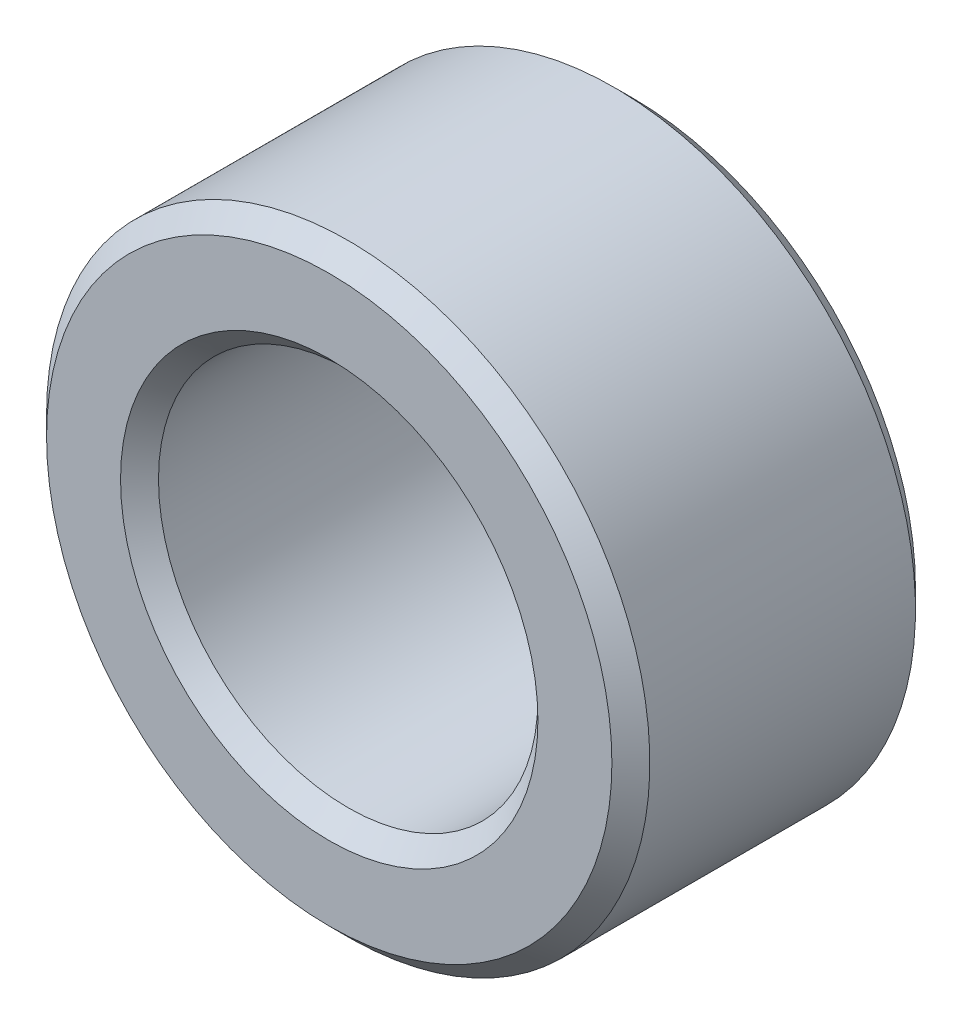
ISO-10303-21;
HEADER;
FILE_DESCRIPTION(('STEP AP214'),'2;1');
FILE_NAME('part.step','',(''),(''),'','','');
FILE_SCHEMA(('AUTOMOTIVE_DESIGN { 1 0 10303 214 1 1 1 1 }'));
ENDSEC;
DATA;
#1=APPLICATION_CONTEXT('core data for automotive mechanical design processes');
#2=APPLICATION_PROTOCOL_DEFINITION('international standard','automotive_design',2000,#1);
#3=PRODUCT_CONTEXT('',#1,'mechanical');
#4=PRODUCT('Part','Part','',(#3));
#5=PRODUCT_RELATED_PRODUCT_CATEGORY('part','',(#4));
#6=PRODUCT_DEFINITION_FORMATION('','',#4);
#7=PRODUCT_DEFINITION_CONTEXT('part definition',#1,'design');
#8=PRODUCT_DEFINITION('design','',#6,#7);
#9=PRODUCT_DEFINITION_SHAPE('','',#8);
#10=(LENGTH_UNIT() NAMED_UNIT(*) SI_UNIT(.MILLI.,.METRE.));
#11=(NAMED_UNIT(*) PLANE_ANGLE_UNIT() SI_UNIT($,.RADIAN.));
#12=(NAMED_UNIT(*) SI_UNIT($,.STERADIAN.) SOLID_ANGLE_UNIT());
#13=UNCERTAINTY_MEASURE_WITH_UNIT(LENGTH_MEASURE(1.E-05),#10,'distance_accuracy_value','');
#14=(GEOMETRIC_REPRESENTATION_CONTEXT(3) GLOBAL_UNCERTAINTY_ASSIGNED_CONTEXT((#13)) GLOBAL_UNIT_ASSIGNED_CONTEXT((#10,
#11,#12)) REPRESENTATION_CONTEXT('',''));
#15=CARTESIAN_POINT('',(0.,0.,0.));
#16=DIRECTION('',(0.,0.,1.));
#17=DIRECTION('',(1.,0.,0.));
#18=AXIS2_PLACEMENT_3D('',#15,#16,#17);
#19=CARTESIAN_POINT('',(0.,0.,8.));
#20=DIRECTION('',(0.,0.,-1.));
#21=DIRECTION('',(-1.,0.,0.));
#22=AXIS2_PLACEMENT_3D('',#19,#20,#21);
#23=CYLINDRICAL_SURFACE('',#22,5.);
#24=CARTESIAN_POINT('',(0.,0.,0.5));
#25=DIRECTION('',(0.,0.,-1.));
#26=DIRECTION('',(-1.,0.,0.));
#27=AXIS2_PLACEMENT_3D('',#24,#25,#26);
#28=CIRCLE('',#27,5.);
#29=CARTESIAN_POINT('',(-5.,0.,0.499999999999999));
#30=VERTEX_POINT('',#29);
#31=EDGE_CURVE('E41',#30,#30,#28,.T.);
#32=ORIENTED_EDGE('',*,*,#31,.T.);
#33=EDGE_LOOP('',(#32));
#34=FACE_BOUND('',#33,.T.);
#35=CARTESIAN_POINT('',(0.,0.,7.5));
#36=DIRECTION('',(0.,0.,-1.));
#37=DIRECTION('',(-1.,0.,0.));
#38=AXIS2_PLACEMENT_3D('',#35,#36,#37);
#39=CIRCLE('',#38,5.);
#40=CARTESIAN_POINT('',(-5.00000000000001,0.,7.5));
#41=VERTEX_POINT('',#40);
#42=EDGE_CURVE('E44',#41,#41,#39,.F.);
#43=ORIENTED_EDGE('',*,*,#42,.T.);
#44=EDGE_LOOP('',(#43));
#45=FACE_BOUND('',#44,.T.);
#46=ADVANCED_FACE('F15',(#34,#45),#23,.F.);
#47=CARTESIAN_POINT('',(0.,0.,8.));
#48=DIRECTION('',(0.,0.,-1.));
#49=DIRECTION('',(-1.,0.,0.));
#50=AXIS2_PLACEMENT_3D('',#47,#48,#49);
#51=CYLINDRICAL_SURFACE('',#50,7.95);
#52=CARTESIAN_POINT('',(0.,0.,0.5));
#53=DIRECTION('',(0.,0.,-1.));
#54=DIRECTION('',(-1.,0.,0.));
#55=AXIS2_PLACEMENT_3D('',#52,#53,#54);
#56=CIRCLE('',#55,7.95);
#57=CARTESIAN_POINT('',(-7.95,0.,0.499999999999999));
#58=VERTEX_POINT('',#57);
#59=EDGE_CURVE('E26',#58,#58,#56,.F.);
#60=ORIENTED_EDGE('',*,*,#59,.T.);
#61=EDGE_LOOP('',(#60));
#62=FACE_BOUND('',#61,.T.);
#63=CARTESIAN_POINT('',(0.,0.,7.5));
#64=DIRECTION('',(0.,0.,-1.));
#65=DIRECTION('',(-1.,0.,0.));
#66=AXIS2_PLACEMENT_3D('',#63,#64,#65);
#67=CIRCLE('',#66,7.95);
#68=CARTESIAN_POINT('',(-7.95000000000001,0.,7.5));
#69=VERTEX_POINT('',#68);
#70=EDGE_CURVE('E30',#69,#69,#67,.T.);
#71=ORIENTED_EDGE('',*,*,#70,.T.);
#72=EDGE_LOOP('',(#71));
#73=FACE_BOUND('',#72,.T.);
#74=ADVANCED_FACE('F17',(#62,#73),#51,.T.);
#75=CARTESIAN_POINT('',(0.,0.,8.));
#76=DIRECTION('',(0.,0.,-1.));
#77=DIRECTION('',(-1.,0.,0.));
#78=AXIS2_PLACEMENT_3D('',#75,#76,#77);
#79=PLANE('',#78);
#80=CARTESIAN_POINT('',(0.,0.,8.));
#81=DIRECTION('',(0.,0.,-1.));
#82=DIRECTION('',(-1.,0.,0.));
#83=AXIS2_PLACEMENT_3D('',#80,#81,#82);
#84=CIRCLE('',#83,7.45);
#85=CARTESIAN_POINT('',(-7.45000000000001,0.,8.));
#86=VERTEX_POINT('',#85);
#87=EDGE_CURVE('E10',#86,#86,#84,.F.);
#88=ORIENTED_EDGE('',*,*,#87,.T.);
#89=EDGE_LOOP('',(#88));
#90=FACE_BOUND('',#89,.T.);
#91=CARTESIAN_POINT('',(0.,0.,8.));
#92=DIRECTION('',(0.,0.,-1.));
#93=DIRECTION('',(-1.,0.,0.));
#94=AXIS2_PLACEMENT_3D('',#91,#92,#93);
#95=CIRCLE('',#94,5.5);
#96=CARTESIAN_POINT('',(-5.50000000000001,0.,8.));
#97=VERTEX_POINT('',#96);
#98=EDGE_CURVE('E22',#97,#97,#95,.T.);
#99=ORIENTED_EDGE('',*,*,#98,.T.);
#100=EDGE_LOOP('',(#99));
#101=FACE_BOUND('',#100,.T.);
#102=ADVANCED_FACE('F66',(#90,#101),#79,.F.);
#103=CARTESIAN_POINT('',(0.,0.,0.));
#104=DIRECTION('',(0.,0.,-1.));
#105=DIRECTION('',(-1.,0.,0.));
#106=AXIS2_PLACEMENT_3D('',#103,#104,#105);
#107=PLANE('',#106);
#108=CARTESIAN_POINT('',(0.,0.,0.));
#109=DIRECTION('',(0.,0.,-1.));
#110=DIRECTION('',(-1.,0.,0.));
#111=AXIS2_PLACEMENT_3D('',#108,#109,#110);
#112=CIRCLE('',#111,5.5);
#113=CARTESIAN_POINT('',(-5.5,0.,0.));
#114=VERTEX_POINT('',#113);
#115=EDGE_CURVE('E35',#114,#114,#112,.F.);
#116=ORIENTED_EDGE('',*,*,#115,.T.);
#117=EDGE_LOOP('',(#116));
#118=FACE_BOUND('',#117,.T.);
#119=CARTESIAN_POINT('',(0.,0.,0.));
#120=DIRECTION('',(0.,0.,-1.));
#121=DIRECTION('',(-1.,0.,0.));
#122=AXIS2_PLACEMENT_3D('',#119,#120,#121);
#123=CIRCLE('',#122,7.45);
#124=CARTESIAN_POINT('',(-7.45,0.,0.));
#125=VERTEX_POINT('',#124);
#126=EDGE_CURVE('E38',#125,#125,#123,.T.);
#127=ORIENTED_EDGE('',*,*,#126,.T.);
#128=EDGE_LOOP('',(#127));
#129=FACE_BOUND('',#128,.T.);
#130=ADVANCED_FACE('F71',(#118,#129),#107,.T.);
#131=CARTESIAN_POINT('',(0.,0.,0.5));
#132=DIRECTION('',(0.,0.,-1.));
#133=DIRECTION('',(-1.,0.,0.));
#134=AXIS2_PLACEMENT_3D('',#131,#132,#133);
#135=CONICAL_SURFACE('',#134,5.,0.785398163397448);
#136=ORIENTED_EDGE('',*,*,#115,.F.);
#137=EDGE_LOOP('',(#136));
#138=FACE_BOUND('',#137,.T.);
#139=ORIENTED_EDGE('',*,*,#31,.F.);
#140=EDGE_LOOP('',(#139));
#141=FACE_BOUND('',#140,.T.);
#142=ADVANCED_FACE('F74',(#138,#141),#135,.F.);
#143=CARTESIAN_POINT('',(0.,0.,0.));
#144=DIRECTION('',(0.,0.,1.));
#145=DIRECTION('',(1.,0.,0.));
#146=AXIS2_PLACEMENT_3D('',#143,#144,#145);
#147=CONICAL_SURFACE('',#146,7.45,0.785398163397448);
#148=ORIENTED_EDGE('',*,*,#59,.F.);
#149=EDGE_LOOP('',(#148));
#150=FACE_BOUND('',#149,.T.);
#151=ORIENTED_EDGE('',*,*,#126,.F.);
#152=EDGE_LOOP('',(#151));
#153=FACE_BOUND('',#152,.T.);
#154=ADVANCED_FACE('F58',(#150,#153),#147,.T.);
#155=CARTESIAN_POINT('',(0.,0.,7.5));
#156=DIRECTION('',(0.,0.,-1.));
#157=DIRECTION('',(-1.,0.,0.));
#158=AXIS2_PLACEMENT_3D('',#155,#156,#157);
#159=CONICAL_SURFACE('',#158,7.95,0.785398163397448);
#160=ORIENTED_EDGE('',*,*,#87,.F.);
#161=EDGE_LOOP('',(#160));
#162=FACE_BOUND('',#161,.T.);
#163=ORIENTED_EDGE('',*,*,#70,.F.);
#164=EDGE_LOOP('',(#163));
#165=FACE_BOUND('',#164,.T.);
#166=ADVANCED_FACE('F52',(#162,#165),#159,.T.);
#167=CARTESIAN_POINT('',(0.,0.,8.));
#168=DIRECTION('',(0.,0.,1.));
#169=DIRECTION('',(1.,0.,0.));
#170=AXIS2_PLACEMENT_3D('',#167,#168,#169);
#171=CONICAL_SURFACE('',#170,5.5,0.785398163397448);
#172=ORIENTED_EDGE('',*,*,#42,.F.);
#173=EDGE_LOOP('',(#172));
#174=FACE_BOUND('',#173,.T.);
#175=ORIENTED_EDGE('',*,*,#98,.F.);
#176=EDGE_LOOP('',(#175));
#177=FACE_BOUND('',#176,.T.);
#178=ADVANCED_FACE('F49',(#174,#177),#171,.F.);
#179=CLOSED_SHELL('',(#46,#74,#102,#130,#142,#154,#166,#178));
#180=MANIFOLD_SOLID_BREP('B1',#179);
#181=ADVANCED_BREP_SHAPE_REPRESENTATION('',(#18,#180),#14);
#182=SHAPE_DEFINITION_REPRESENTATION(#9,#181);
ENDSEC;
END-ISO-10303-21;
